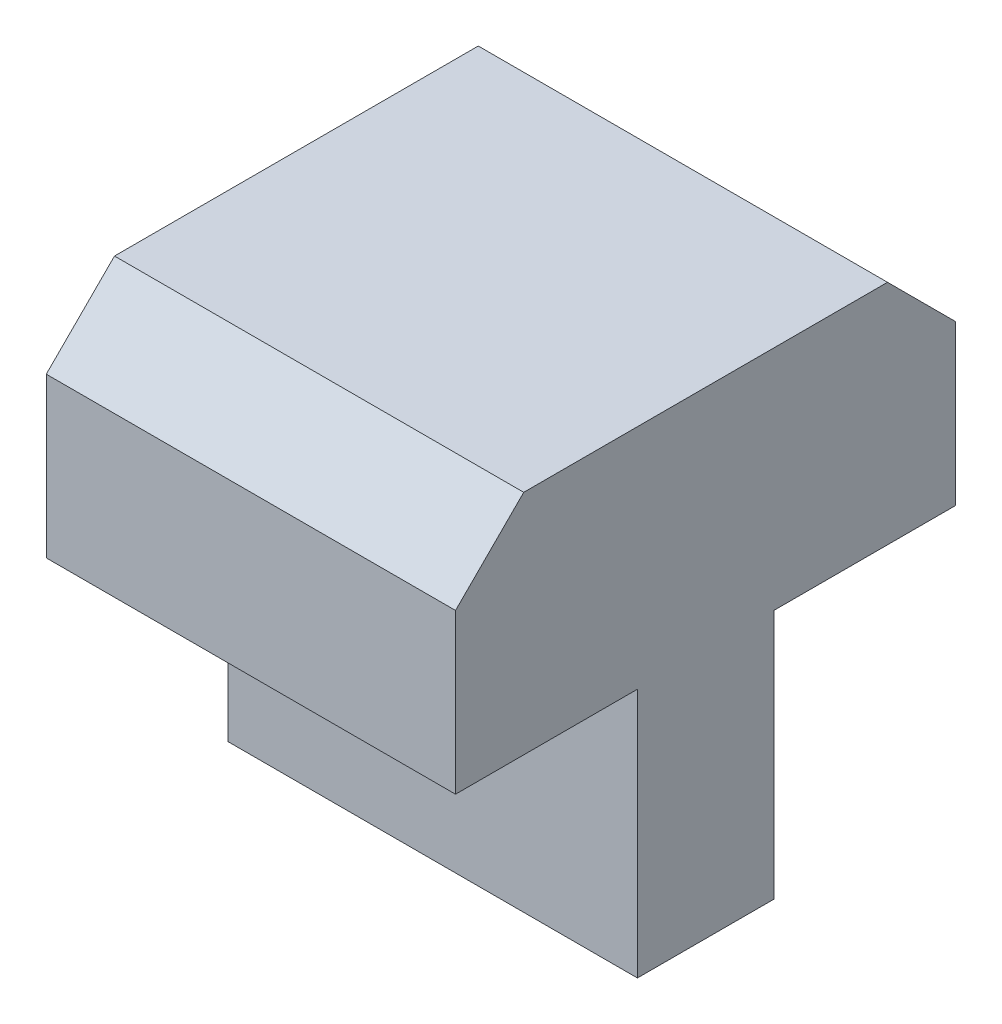
ISO-10303-21;
HEADER;
FILE_DESCRIPTION(('STEP AP214'),'2;1');
FILE_NAME('part.step','',(''),(''),'','','');
FILE_SCHEMA(('AUTOMOTIVE_DESIGN { 1 0 10303 214 1 1 1 1 }'));
ENDSEC;
DATA;
#1=APPLICATION_CONTEXT('core data for automotive mechanical design processes');
#2=APPLICATION_PROTOCOL_DEFINITION('international standard','automotive_design',2000,#1);
#3=PRODUCT_CONTEXT('',#1,'mechanical');
#4=PRODUCT('Part','Part','',(#3));
#5=PRODUCT_RELATED_PRODUCT_CATEGORY('part','',(#4));
#6=PRODUCT_DEFINITION_FORMATION('','',#4);
#7=PRODUCT_DEFINITION_CONTEXT('part definition',#1,'design');
#8=PRODUCT_DEFINITION('design','',#6,#7);
#9=PRODUCT_DEFINITION_SHAPE('','',#8);
#10=(LENGTH_UNIT() NAMED_UNIT(*) SI_UNIT(.MILLI.,.METRE.));
#11=(NAMED_UNIT(*) PLANE_ANGLE_UNIT() SI_UNIT($,.RADIAN.));
#12=(NAMED_UNIT(*) SI_UNIT($,.STERADIAN.) SOLID_ANGLE_UNIT());
#13=UNCERTAINTY_MEASURE_WITH_UNIT(LENGTH_MEASURE(1.E-05),#10,'distance_accuracy_value','');
#14=(GEOMETRIC_REPRESENTATION_CONTEXT(3) GLOBAL_UNCERTAINTY_ASSIGNED_CONTEXT((#13)) GLOBAL_UNIT_ASSIGNED_CONTEXT((#10,
#11,#12)) REPRESENTATION_CONTEXT('',''));
#15=CARTESIAN_POINT('',(0.,0.,0.));
#16=DIRECTION('',(0.,0.,1.));
#17=DIRECTION('',(1.,0.,0.));
#18=AXIS2_PLACEMENT_3D('',#15,#16,#17);
#19=CARTESIAN_POINT('',(0.,0.,0.));
#20=DIRECTION('',(0.,-1.,0.));
#21=DIRECTION('',(0.,0.,-1.));
#22=AXIS2_PLACEMENT_3D('',#19,#20,#21);
#23=PLANE('',#22);
#24=DIRECTION('',(1.,0.,0.));
#25=VECTOR('',#24,1.);
#26=CARTESIAN_POINT('',(-9.,0.,-3.));
#27=LINE('',#26,#25);
#28=CARTESIAN_POINT('',(-9.,0.,-3.));
#29=VERTEX_POINT('',#28);
#30=CARTESIAN_POINT('',(9.,0.,-3.));
#31=VERTEX_POINT('',#30);
#32=EDGE_CURVE('E113',#29,#31,#27,.T.);
#33=ORIENTED_EDGE('',*,*,#32,.F.);
#34=DIRECTION('',(0.,0.,1.));
#35=VECTOR('',#34,1.);
#36=CARTESIAN_POINT('',(-9.,0.,11.));
#37=LINE('',#36,#35);
#38=CARTESIAN_POINT('',(-9.,0.,-11.));
#39=VERTEX_POINT('',#38);
#40=EDGE_CURVE('E166',#39,#29,#37,.T.);
#41=ORIENTED_EDGE('',*,*,#40,.F.);
#42=DIRECTION('',(-1.,0.,0.));
#43=VECTOR('',#42,1.);
#44=CARTESIAN_POINT('',(-9.,0.,-11.));
#45=LINE('',#44,#43);
#46=CARTESIAN_POINT('',(9.,0.,-11.));
#47=VERTEX_POINT('',#46);
#48=EDGE_CURVE('E151',#47,#39,#45,.T.);
#49=ORIENTED_EDGE('',*,*,#48,.F.);
#50=DIRECTION('',(0.,0.,-1.));
#51=VECTOR('',#50,1.);
#52=CARTESIAN_POINT('',(9.,0.,11.));
#53=LINE('',#52,#51);
#54=EDGE_CURVE('E119',#31,#47,#53,.T.);
#55=ORIENTED_EDGE('',*,*,#54,.F.);
#56=EDGE_LOOP('',(#33,#41,#49,#55));
#57=FACE_BOUND('',#56,.T.);
#58=ADVANCED_FACE('F17',(#57),#23,.T.);
#59=CARTESIAN_POINT('',(9.,10.,11.));
#60=DIRECTION('',(-1.,0.,0.));
#61=DIRECTION('',(0.,0.,1.));
#62=AXIS2_PLACEMENT_3D('',#59,#60,#61);
#63=PLANE('',#62);
#64=DIRECTION('',(0.,-1.,0.));
#65=VECTOR('',#64,1.);
#66=CARTESIAN_POINT('',(9.,10.,-11.));
#67=LINE('',#66,#65);
#68=CARTESIAN_POINT('',(9.,7.,-11.));
#69=VERTEX_POINT('',#68);
#70=EDGE_CURVE('E157',#69,#47,#67,.T.);
#71=ORIENTED_EDGE('',*,*,#70,.F.);
#72=DIRECTION('',(0.,-0.707106781186549,-0.707106781186546));
#73=VECTOR('',#72,1.);
#74=CARTESIAN_POINT('',(9.,10.,-8.));
#75=LINE('',#74,#73);
#76=CARTESIAN_POINT('',(9.,10.,-8.));
#77=VERTEX_POINT('',#76);
#78=EDGE_CURVE('E25',#69,#77,#75,.F.);
#79=ORIENTED_EDGE('',*,*,#78,.T.);
#80=DIRECTION('',(0.,0.,-1.));
#81=VECTOR('',#80,1.);
#82=CARTESIAN_POINT('',(9.,10.,11.));
#83=LINE('',#82,#81);
#84=CARTESIAN_POINT('',(9.,10.,8.));
#85=VERTEX_POINT('',#84);
#86=EDGE_CURVE('E141',#85,#77,#83,.T.);
#87=ORIENTED_EDGE('',*,*,#86,.F.);
#88=DIRECTION('',(0.,0.707106781186549,-0.707106781186546));
#89=VECTOR('',#88,1.);
#90=CARTESIAN_POINT('',(9.,10.,8.));
#91=LINE('',#90,#89);
#92=CARTESIAN_POINT('',(9.,7.,11.));
#93=VERTEX_POINT('',#92);
#94=EDGE_CURVE('E32',#85,#93,#91,.F.);
#95=ORIENTED_EDGE('',*,*,#94,.T.);
#96=DIRECTION('',(0.,-1.,0.));
#97=VECTOR('',#96,1.);
#98=CARTESIAN_POINT('',(9.,10.,11.));
#99=LINE('',#98,#97);
#100=CARTESIAN_POINT('',(9.,0.,11.));
#101=VERTEX_POINT('',#100);
#102=EDGE_CURVE('E148',#93,#101,#99,.T.);
#103=ORIENTED_EDGE('',*,*,#102,.T.);
#104=CARTESIAN_POINT('',(9.,0.,3.));
#105=VERTEX_POINT('',#104);
#106=EDGE_CURVE('E118',#101,#105,#53,.T.);
#107=ORIENTED_EDGE('',*,*,#106,.T.);
#108=DIRECTION('',(0.,1.,0.));
#109=VECTOR('',#108,1.);
#110=CARTESIAN_POINT('',(9.,-11.,3.));
#111=LINE('',#110,#109);
#112=CARTESIAN_POINT('',(9.,-11.,3.));
#113=VERTEX_POINT('',#112);
#114=EDGE_CURVE('E99',#113,#105,#111,.T.);
#115=ORIENTED_EDGE('',*,*,#114,.F.);
#116=DIRECTION('',(0.,0.,1.));
#117=VECTOR('',#116,1.);
#118=CARTESIAN_POINT('',(9.,-11.,-3.));
#119=LINE('',#118,#117);
#120=CARTESIAN_POINT('',(9.,-11.,-3.));
#121=VERTEX_POINT('',#120);
#122=EDGE_CURVE('E105',#121,#113,#119,.T.);
#123=ORIENTED_EDGE('',*,*,#122,.F.);
#124=DIRECTION('',(0.,1.,0.));
#125=VECTOR('',#124,1.);
#126=CARTESIAN_POINT('',(9.,-11.,-3.));
#127=LINE('',#126,#125);
#128=EDGE_CURVE('E134',#121,#31,#127,.T.);
#129=ORIENTED_EDGE('',*,*,#128,.T.);
#130=ORIENTED_EDGE('',*,*,#54,.T.);
#131=EDGE_LOOP('',(#71,#79,#87,#95,#103,#107,#115,#123,#129,#130));
#132=FACE_BOUND('',#131,.T.);
#133=ADVANCED_FACE('F116',(#132),#63,.F.);
#134=CARTESIAN_POINT('',(-9.,10.,-11.));
#135=DIRECTION('',(0.,0.,1.));
#136=DIRECTION('',(1.,0.,0.));
#137=AXIS2_PLACEMENT_3D('',#134,#135,#136);
#138=PLANE('',#137);
#139=DIRECTION('',(0.,-1.,0.));
#140=VECTOR('',#139,1.);
#141=CARTESIAN_POINT('',(-9.,10.,-11.));
#142=LINE('',#141,#140);
#143=CARTESIAN_POINT('',(-9.,7.,-11.));
#144=VERTEX_POINT('',#143);
#145=EDGE_CURVE('E160',#144,#39,#142,.T.);
#146=ORIENTED_EDGE('',*,*,#145,.F.);
#147=DIRECTION('',(1.,0.,0.));
#148=VECTOR('',#147,1.);
#149=CARTESIAN_POINT('',(-9.,7.,-11.));
#150=LINE('',#149,#148);
#151=EDGE_CURVE('E40',#144,#69,#150,.T.);
#152=ORIENTED_EDGE('',*,*,#151,.T.);
#153=ORIENTED_EDGE('',*,*,#70,.T.);
#154=ORIENTED_EDGE('',*,*,#48,.T.);
#155=EDGE_LOOP('',(#146,#152,#153,#154));
#156=FACE_BOUND('',#155,.T.);
#157=ADVANCED_FACE('F182',(#156),#138,.F.);
#158=CARTESIAN_POINT('',(-9.,10.,11.));
#159=DIRECTION('',(1.,0.,0.));
#160=DIRECTION('',(0.,0.,-1.));
#161=AXIS2_PLACEMENT_3D('',#158,#159,#160);
#162=PLANE('',#161);
#163=DIRECTION('',(0.,0.,1.));
#164=VECTOR('',#163,1.);
#165=CARTESIAN_POINT('',(-9.,10.,11.));
#166=LINE('',#165,#164);
#167=CARTESIAN_POINT('',(-9.,10.,-8.));
#168=VERTEX_POINT('',#167);
#169=CARTESIAN_POINT('',(-9.,10.,8.));
#170=VERTEX_POINT('',#169);
#171=EDGE_CURVE('E144',#168,#170,#166,.T.);
#172=ORIENTED_EDGE('',*,*,#171,.F.);
#173=DIRECTION('',(0.,0.707106781186549,0.707106781186546));
#174=VECTOR('',#173,1.);
#175=CARTESIAN_POINT('',(-9.,10.,-8.));
#176=LINE('',#175,#174);
#177=EDGE_CURVE('E227',#168,#144,#176,.F.);
#178=ORIENTED_EDGE('',*,*,#177,.T.);
#179=ORIENTED_EDGE('',*,*,#145,.T.);
#180=ORIENTED_EDGE('',*,*,#40,.T.);
#181=DIRECTION('',(0.,1.,0.));
#182=VECTOR('',#181,1.);
#183=CARTESIAN_POINT('',(-9.,-11.,-3.));
#184=LINE('',#183,#182);
#185=CARTESIAN_POINT('',(-9.,-11.,-3.));
#186=VERTEX_POINT('',#185);
#187=EDGE_CURVE('E123',#186,#29,#184,.T.);
#188=ORIENTED_EDGE('',*,*,#187,.F.);
#189=DIRECTION('',(0.,0.,-1.));
#190=VECTOR('',#189,1.);
#191=CARTESIAN_POINT('',(-9.,-11.,-3.));
#192=LINE('',#191,#190);
#193=CARTESIAN_POINT('',(-9.,-11.,3.));
#194=VERTEX_POINT('',#193);
#195=EDGE_CURVE('E104',#194,#186,#192,.T.);
#196=ORIENTED_EDGE('',*,*,#195,.F.);
#197=DIRECTION('',(0.,1.,0.));
#198=VECTOR('',#197,1.);
#199=CARTESIAN_POINT('',(-9.,-11.,3.));
#200=LINE('',#199,#198);
#201=CARTESIAN_POINT('',(-9.,0.,3.));
#202=VERTEX_POINT('',#201);
#203=EDGE_CURVE('E101',#194,#202,#200,.T.);
#204=ORIENTED_EDGE('',*,*,#203,.T.);
#205=CARTESIAN_POINT('',(-9.,0.,11.));
#206=VERTEX_POINT('',#205);
#207=EDGE_CURVE('E170',#202,#206,#37,.T.);
#208=ORIENTED_EDGE('',*,*,#207,.T.);
#209=DIRECTION('',(0.,-1.,0.));
#210=VECTOR('',#209,1.);
#211=CARTESIAN_POINT('',(-9.,10.,11.));
#212=LINE('',#211,#210);
#213=CARTESIAN_POINT('',(-9.,7.,11.));
#214=VERTEX_POINT('',#213);
#215=EDGE_CURVE('E162',#214,#206,#212,.T.);
#216=ORIENTED_EDGE('',*,*,#215,.F.);
#217=DIRECTION('',(0.,-0.707106781186549,0.707106781186546));
#218=VECTOR('',#217,1.);
#219=CARTESIAN_POINT('',(-9.,10.,8.));
#220=LINE('',#219,#218);
#221=EDGE_CURVE('E223',#214,#170,#220,.F.);
#222=ORIENTED_EDGE('',*,*,#221,.T.);
#223=EDGE_LOOP('',(#172,#178,#179,#180,#188,#196,#204,#208,#216,#222));
#224=FACE_BOUND('',#223,.T.);
#225=ADVANCED_FACE('F189',(#224),#162,.F.);
#226=CARTESIAN_POINT('',(-9.,10.,11.));
#227=DIRECTION('',(0.,0.,-1.));
#228=DIRECTION('',(-1.,0.,0.));
#229=AXIS2_PLACEMENT_3D('',#226,#227,#228);
#230=PLANE('',#229);
#231=ORIENTED_EDGE('',*,*,#102,.F.);
#232=DIRECTION('',(-1.,0.,0.));
#233=VECTOR('',#232,1.);
#234=CARTESIAN_POINT('',(-9.,7.,11.));
#235=LINE('',#234,#233);
#236=EDGE_CURVE('E11',#93,#214,#235,.T.);
#237=ORIENTED_EDGE('',*,*,#236,.T.);
#238=ORIENTED_EDGE('',*,*,#215,.T.);
#239=DIRECTION('',(1.,0.,0.));
#240=VECTOR('',#239,1.);
#241=CARTESIAN_POINT('',(-9.,0.,11.));
#242=LINE('',#241,#240);
#243=EDGE_CURVE('E145',#206,#101,#242,.T.);
#244=ORIENTED_EDGE('',*,*,#243,.T.);
#245=EDGE_LOOP('',(#231,#237,#238,#244));
#246=FACE_BOUND('',#245,.T.);
#247=ADVANCED_FACE('F191',(#246),#230,.F.);
#248=CARTESIAN_POINT('',(0.,10.,0.));
#249=DIRECTION('',(0.,-1.,0.));
#250=DIRECTION('',(0.,0.,-1.));
#251=AXIS2_PLACEMENT_3D('',#248,#249,#250);
#252=PLANE('',#251);
#253=ORIENTED_EDGE('',*,*,#86,.T.);
#254=DIRECTION('',(-1.,0.,0.));
#255=VECTOR('',#254,1.);
#256=CARTESIAN_POINT('',(0.,10.,-8.));
#257=LINE('',#256,#255);
#258=EDGE_CURVE('E228',#77,#168,#257,.T.);
#259=ORIENTED_EDGE('',*,*,#258,.T.);
#260=ORIENTED_EDGE('',*,*,#171,.T.);
#261=DIRECTION('',(1.,0.,0.));
#262=VECTOR('',#261,1.);
#263=CARTESIAN_POINT('',(0.,10.,8.));
#264=LINE('',#263,#262);
#265=EDGE_CURVE('E159',#170,#85,#264,.T.);
#266=ORIENTED_EDGE('',*,*,#265,.T.);
#267=EDGE_LOOP('',(#253,#259,#260,#266));
#268=FACE_BOUND('',#267,.T.);
#269=ADVANCED_FACE('F199',(#268),#252,.F.);
#270=DIRECTION('',(-1.,0.,0.));
#271=VECTOR('',#270,1.);
#272=CARTESIAN_POINT('',(-9.,0.,3.));
#273=LINE('',#272,#271);
#274=EDGE_CURVE('E133',#105,#202,#273,.T.);
#275=ORIENTED_EDGE('',*,*,#274,.F.);
#276=ORIENTED_EDGE('',*,*,#106,.F.);
#277=ORIENTED_EDGE('',*,*,#243,.F.);
#278=ORIENTED_EDGE('',*,*,#207,.F.);
#279=EDGE_LOOP('',(#275,#276,#277,#278));
#280=FACE_BOUND('',#279,.T.);
#281=ADVANCED_FACE('F205',(#280),#23,.T.);
#282=CARTESIAN_POINT('',(-9.,-11.,3.));
#283=DIRECTION('',(0.,0.,-1.));
#284=DIRECTION('',(-1.,0.,0.));
#285=AXIS2_PLACEMENT_3D('',#282,#283,#284);
#286=PLANE('',#285);
#287=ORIENTED_EDGE('',*,*,#274,.T.);
#288=ORIENTED_EDGE('',*,*,#203,.F.);
#289=DIRECTION('',(-1.,0.,0.));
#290=VECTOR('',#289,1.);
#291=CARTESIAN_POINT('',(-9.,-11.,3.));
#292=LINE('',#291,#290);
#293=EDGE_CURVE('E94',#113,#194,#292,.T.);
#294=ORIENTED_EDGE('',*,*,#293,.F.);
#295=ORIENTED_EDGE('',*,*,#114,.T.);
#296=EDGE_LOOP('',(#287,#288,#294,#295));
#297=FACE_BOUND('',#296,.T.);
#298=ADVANCED_FACE('F97',(#297),#286,.F.);
#299=CARTESIAN_POINT('',(-9.,-11.,-3.));
#300=DIRECTION('',(0.,0.,1.));
#301=DIRECTION('',(1.,0.,0.));
#302=AXIS2_PLACEMENT_3D('',#299,#300,#301);
#303=PLANE('',#302);
#304=ORIENTED_EDGE('',*,*,#32,.T.);
#305=ORIENTED_EDGE('',*,*,#128,.F.);
#306=DIRECTION('',(1.,0.,0.));
#307=VECTOR('',#306,1.);
#308=CARTESIAN_POINT('',(-9.,-11.,-3.));
#309=LINE('',#308,#307);
#310=EDGE_CURVE('E110',#186,#121,#309,.T.);
#311=ORIENTED_EDGE('',*,*,#310,.F.);
#312=ORIENTED_EDGE('',*,*,#187,.T.);
#313=EDGE_LOOP('',(#304,#305,#311,#312));
#314=FACE_BOUND('',#313,.T.);
#315=ADVANCED_FACE('F185',(#314),#303,.F.);
#316=CARTESIAN_POINT('',(0.,-11.,0.));
#317=DIRECTION('',(0.,1.,0.));
#318=DIRECTION('',(0.,0.,1.));
#319=AXIS2_PLACEMENT_3D('',#316,#317,#318);
#320=PLANE('',#319);
#321=ORIENTED_EDGE('',*,*,#122,.T.);
#322=ORIENTED_EDGE('',*,*,#293,.T.);
#323=ORIENTED_EDGE('',*,*,#195,.T.);
#324=ORIENTED_EDGE('',*,*,#310,.T.);
#325=EDGE_LOOP('',(#321,#322,#323,#324));
#326=FACE_BOUND('',#325,.T.);
#327=ADVANCED_FACE('F108',(#326),#320,.F.);
#328=CARTESIAN_POINT('',(0.,10.,-8.));
#329=DIRECTION('',(0.,-0.707106781186546,0.707106781186549));
#330=DIRECTION('',(-1.,0.,0.));
#331=AXIS2_PLACEMENT_3D('',#328,#329,#330);
#332=PLANE('',#331);
#333=ORIENTED_EDGE('',*,*,#78,.F.);
#334=ORIENTED_EDGE('',*,*,#151,.F.);
#335=ORIENTED_EDGE('',*,*,#177,.F.);
#336=ORIENTED_EDGE('',*,*,#258,.F.);
#337=EDGE_LOOP('',(#333,#334,#335,#336));
#338=FACE_BOUND('',#337,.T.);
#339=ADVANCED_FACE('F239',(#338),#332,.F.);
#340=CARTESIAN_POINT('',(0.,10.,8.));
#341=DIRECTION('',(0.,-0.707106781186546,-0.707106781186549));
#342=DIRECTION('',(1.,0.,0.));
#343=AXIS2_PLACEMENT_3D('',#340,#341,#342);
#344=PLANE('',#343);
#345=ORIENTED_EDGE('',*,*,#221,.F.);
#346=ORIENTED_EDGE('',*,*,#236,.F.);
#347=ORIENTED_EDGE('',*,*,#94,.F.);
#348=ORIENTED_EDGE('',*,*,#265,.F.);
#349=EDGE_LOOP('',(#345,#346,#347,#348));
#350=FACE_BOUND('',#349,.T.);
#351=ADVANCED_FACE('F19',(#350),#344,.F.);
#352=CLOSED_SHELL('',(#58,#133,#157,#225,#247,#269,#281,#298,#315,#327,#339,#351));
#353=MANIFOLD_SOLID_BREP('B1',#352);
#354=ADVANCED_BREP_SHAPE_REPRESENTATION('',(#18,#353),#14);
#355=SHAPE_DEFINITION_REPRESENTATION(#9,#354);
ENDSEC;
END-ISO-10303-21;
